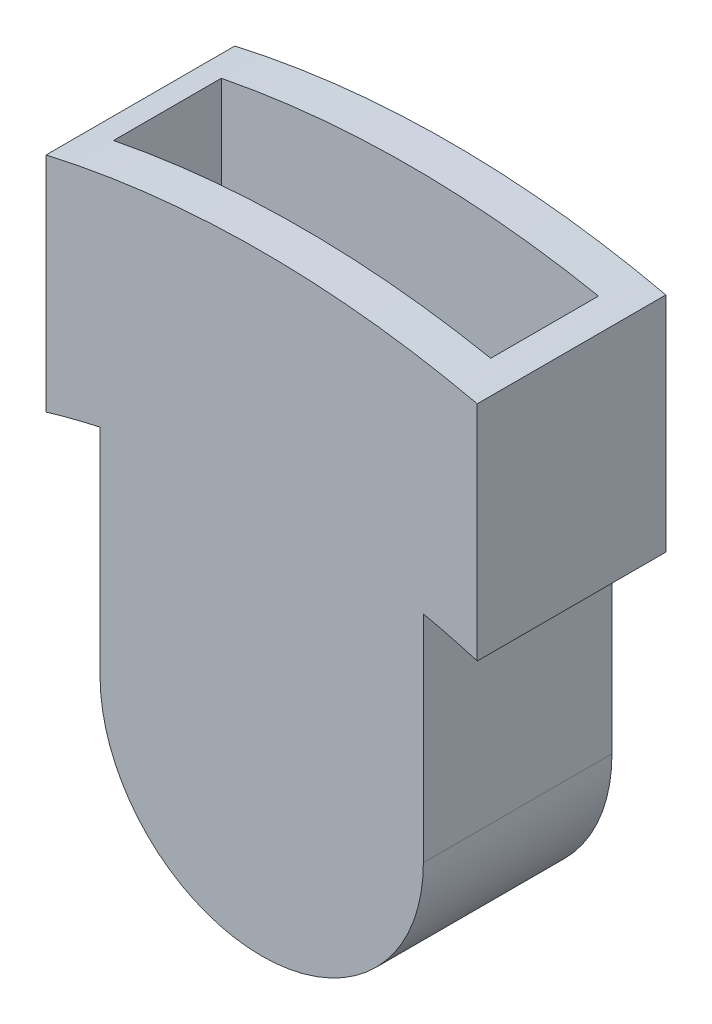
ISO-10303-21;
HEADER;
FILE_DESCRIPTION(('STEP AP214'),'2;1');
FILE_NAME('part.step','',(''),(''),'','','');
FILE_SCHEMA(('AUTOMOTIVE_DESIGN { 1 0 10303 214 1 1 1 1 }'));
ENDSEC;
DATA;
#1=APPLICATION_CONTEXT('core data for automotive mechanical design processes');
#2=APPLICATION_PROTOCOL_DEFINITION('international standard','automotive_design',2000,#1);
#3=PRODUCT_CONTEXT('',#1,'mechanical');
#4=PRODUCT('Part','Part','',(#3));
#5=PRODUCT_RELATED_PRODUCT_CATEGORY('part','',(#4));
#6=PRODUCT_DEFINITION_FORMATION('','',#4);
#7=PRODUCT_DEFINITION_CONTEXT('part definition',#1,'design');
#8=PRODUCT_DEFINITION('design','',#6,#7);
#9=PRODUCT_DEFINITION_SHAPE('','',#8);
#10=(LENGTH_UNIT() NAMED_UNIT(*) SI_UNIT(.MILLI.,.METRE.));
#11=(NAMED_UNIT(*) PLANE_ANGLE_UNIT() SI_UNIT($,.RADIAN.));
#12=(NAMED_UNIT(*) SI_UNIT($,.STERADIAN.) SOLID_ANGLE_UNIT());
#13=UNCERTAINTY_MEASURE_WITH_UNIT(LENGTH_MEASURE(1.E-05),#10,'distance_accuracy_value','');
#14=(GEOMETRIC_REPRESENTATION_CONTEXT(3) GLOBAL_UNCERTAINTY_ASSIGNED_CONTEXT((#13)) GLOBAL_UNIT_ASSIGNED_CONTEXT((#10,
#11,#12)) REPRESENTATION_CONTEXT('',''));
#15=CARTESIAN_POINT('',(0.,0.,0.));
#16=DIRECTION('',(0.,0.,1.));
#17=DIRECTION('',(1.,0.,0.));
#18=AXIS2_PLACEMENT_3D('',#15,#16,#17);
#19=CARTESIAN_POINT('',(3.,9.67479523881774,3.5));
#20=DIRECTION('',(-1.,0.,0.));
#21=DIRECTION('',(0.,-1.,0.));
#22=AXIS2_PLACEMENT_3D('',#19,#20,#21);
#23=PLANE('',#22);
#24=DIRECTION('',(0.,1.,0.));
#25=VECTOR('',#24,1.);
#26=CARTESIAN_POINT('',(3.,9.67479523881774,0.));
#27=LINE('',#26,#25);
#28=CARTESIAN_POINT('',(3.,9.67479523881773,0.));
#29=VERTEX_POINT('',#28);
#30=CARTESIAN_POINT('',(3.,13.6747943311773,0.));
#31=VERTEX_POINT('',#30);
#32=EDGE_CURVE('E138',#29,#31,#27,.T.);
#33=ORIENTED_EDGE('',*,*,#32,.T.);
#34=DIRECTION('',(0.,0.,-1.));
#35=VECTOR('',#34,1.);
#36=CARTESIAN_POINT('',(3.,13.6747943311773,3.5));
#37=LINE('',#36,#35);
#38=CARTESIAN_POINT('',(3.,13.6747943311773,3.5));
#39=VERTEX_POINT('',#38);
#40=EDGE_CURVE('E175',#39,#31,#37,.T.);
#41=ORIENTED_EDGE('',*,*,#40,.F.);
#42=DIRECTION('',(0.,1.,0.));
#43=VECTOR('',#42,1.);
#44=CARTESIAN_POINT('',(3.,9.67479523881774,3.5));
#45=LINE('',#44,#43);
#46=CARTESIAN_POINT('',(3.,9.67479523881773,3.5));
#47=VERTEX_POINT('',#46);
#48=EDGE_CURVE('E84',#47,#39,#45,.T.);
#49=ORIENTED_EDGE('',*,*,#48,.F.);
#50=DIRECTION('',(0.,0.,-1.));
#51=VECTOR('',#50,1.);
#52=CARTESIAN_POINT('',(3.,9.67479523881773,3.5));
#53=LINE('',#52,#51);
#54=EDGE_CURVE('E179',#47,#29,#53,.T.);
#55=ORIENTED_EDGE('',*,*,#54,.T.);
#56=EDGE_LOOP('',(#33,#41,#49,#55));
#57=FACE_BOUND('',#56,.T.);
#58=ADVANCED_FACE('F17',(#57),#23,.F.);
#59=CARTESIAN_POINT('',(0.,0.,3.5));
#60=DIRECTION('',(0.,0.,-1.));
#61=DIRECTION('',(-1.,0.,0.));
#62=AXIS2_PLACEMENT_3D('',#59,#60,#61);
#63=CYLINDRICAL_SURFACE('',#62,14.);
#64=CARTESIAN_POINT('',(0.,0.,0.));
#65=DIRECTION('',(0.,0.,-1.));
#66=DIRECTION('',(1.,0.,0.));
#67=AXIS2_PLACEMENT_3D('',#64,#65,#66);
#68=CIRCLE('',#67,14.);
#69=CARTESIAN_POINT('',(4.00000000004449,13.4164078649855,0.));
#70=VERTEX_POINT('',#69);
#71=EDGE_CURVE('E141',#31,#70,#68,.T.);
#72=ORIENTED_EDGE('',*,*,#71,.T.);
#73=DIRECTION('',(0.,0.,-1.));
#74=VECTOR('',#73,1.);
#75=CARTESIAN_POINT('',(4.00000000004449,13.4164078649855,3.5));
#76=LINE('',#75,#74);
#77=CARTESIAN_POINT('',(4.00000000004449,13.4164078649855,3.5));
#78=VERTEX_POINT('',#77);
#79=EDGE_CURVE('E171',#78,#70,#76,.T.);
#80=ORIENTED_EDGE('',*,*,#79,.F.);
#81=CARTESIAN_POINT('',(0.,0.,3.5));
#82=DIRECTION('',(0.,0.,-1.));
#83=DIRECTION('',(1.,0.,0.));
#84=AXIS2_PLACEMENT_3D('',#81,#82,#83);
#85=CIRCLE('',#84,14.);
#86=EDGE_CURVE('E233',#39,#78,#85,.T.);
#87=ORIENTED_EDGE('',*,*,#86,.F.);
#88=ORIENTED_EDGE('',*,*,#40,.T.);
#89=EDGE_LOOP('',(#72,#80,#87,#88));
#90=FACE_BOUND('',#89,.T.);
#91=ADVANCED_FACE('F279',(#90),#63,.F.);
#92=CARTESIAN_POINT('',(4.,13.4164078649987,3.5));
#93=DIRECTION('',(-1.,0.,0.));
#94=DIRECTION('',(0.,-1.,0.));
#95=AXIS2_PLACEMENT_3D('',#92,#93,#94);
#96=PLANE('',#95);
#97=DIRECTION('',(0.,1.,0.));
#98=VECTOR('',#97,1.);
#99=CARTESIAN_POINT('',(4.,13.4164078649987,0.));
#100=LINE('',#99,#98);
#101=CARTESIAN_POINT('',(4.,17.5499297053557,0.));
#102=VERTEX_POINT('',#101);
#103=EDGE_CURVE('E144',#70,#102,#100,.T.);
#104=ORIENTED_EDGE('',*,*,#103,.T.);
#105=DIRECTION('',(0.,0.,-1.));
#106=VECTOR('',#105,1.);
#107=CARTESIAN_POINT('',(4.,17.5499297053557,3.5));
#108=LINE('',#107,#106);
#109=CARTESIAN_POINT('',(4.,17.5499297053557,3.5));
#110=VERTEX_POINT('',#109);
#111=EDGE_CURVE('E167',#110,#102,#108,.T.);
#112=ORIENTED_EDGE('',*,*,#111,.F.);
#113=DIRECTION('',(0.,1.,0.));
#114=VECTOR('',#113,1.);
#115=CARTESIAN_POINT('',(4.,13.4164078649987,3.5));
#116=LINE('',#115,#114);
#117=EDGE_CURVE('E235',#78,#110,#116,.T.);
#118=ORIENTED_EDGE('',*,*,#117,.F.);
#119=ORIENTED_EDGE('',*,*,#79,.T.);
#120=EDGE_LOOP('',(#104,#112,#118,#119));
#121=FACE_BOUND('',#120,.T.);
#122=ADVANCED_FACE('F283',(#121),#96,.F.);
#123=CARTESIAN_POINT('',(0.,0.,3.5));
#124=DIRECTION('',(0.,0.,-1.));
#125=DIRECTION('',(-1.,0.,0.));
#126=AXIS2_PLACEMENT_3D('',#123,#124,#125);
#127=CYLINDRICAL_SURFACE('',#126,18.0000009073034);
#128=DIRECTION('',(0.,0.,-1.));
#129=VECTOR('',#128,1.);
#130=CARTESIAN_POINT('',(-3.4999999038955,17.6564445270178,3.5));
#131=LINE('',#130,#129);
#132=CARTESIAN_POINT('',(-3.4999999038955,17.6564445270178,2.75));
#133=VERTEX_POINT('',#132);
#134=CARTESIAN_POINT('',(-3.4999999038955,17.6564445270178,0.75));
#135=VERTEX_POINT('',#134);
#136=EDGE_CURVE('E11',#133,#135,#131,.T.);
#137=ORIENTED_EDGE('',*,*,#136,.T.);
#138=CARTESIAN_POINT('',(0.,0.,0.75));
#139=DIRECTION('',(0.,0.,-1.));
#140=DIRECTION('',(-1.,0.,0.));
#141=AXIS2_PLACEMENT_3D('',#138,#139,#140);
#142=CIRCLE('',#141,18.0000009073034);
#143=CARTESIAN_POINT('',(3.5000000961045,17.6564444889166,0.75));
#144=VERTEX_POINT('',#143);
#145=EDGE_CURVE('E182',#135,#144,#142,.T.);
#146=ORIENTED_EDGE('',*,*,#145,.T.);
#147=DIRECTION('',(0.,0.,-1.));
#148=VECTOR('',#147,1.);
#149=CARTESIAN_POINT('',(3.5000000961045,17.6564444889166,3.5));
#150=LINE('',#149,#148);
#151=CARTESIAN_POINT('',(3.5000000961045,17.6564444889166,2.75));
#152=VERTEX_POINT('',#151);
#153=EDGE_CURVE('E186',#144,#152,#150,.F.);
#154=ORIENTED_EDGE('',*,*,#153,.T.);
#155=CARTESIAN_POINT('',(0.,0.,2.75));
#156=DIRECTION('',(0.,0.,1.));
#157=DIRECTION('',(1.,0.,0.));
#158=AXIS2_PLACEMENT_3D('',#155,#156,#157);
#159=CIRCLE('',#158,18.0000009073034);
#160=EDGE_CURVE('E25',#152,#133,#159,.T.);
#161=ORIENTED_EDGE('',*,*,#160,.T.);
#162=EDGE_LOOP('',(#137,#146,#154,#161));
#163=FACE_BOUND('',#162,.T.);
#164=CARTESIAN_POINT('',(0.,0.,0.));
#165=DIRECTION('',(0.,0.,1.));
#166=DIRECTION('',(-1.,0.,0.));
#167=AXIS2_PLACEMENT_3D('',#164,#165,#166);
#168=CIRCLE('',#167,18.0000009073034);
#169=CARTESIAN_POINT('',(-4.,17.5499297053557,0.));
#170=VERTEX_POINT('',#169);
#171=EDGE_CURVE('E148',#102,#170,#168,.T.);
#172=ORIENTED_EDGE('',*,*,#171,.T.);
#173=DIRECTION('',(0.,0.,-1.));
#174=VECTOR('',#173,1.);
#175=CARTESIAN_POINT('',(-4.,17.5499297053557,3.5));
#176=LINE('',#175,#174);
#177=CARTESIAN_POINT('',(-4.,17.5499297053557,3.5));
#178=VERTEX_POINT('',#177);
#179=EDGE_CURVE('E121',#178,#170,#176,.T.);
#180=ORIENTED_EDGE('',*,*,#179,.F.);
#181=CARTESIAN_POINT('',(0.,0.,3.5));
#182=DIRECTION('',(0.,0.,1.));
#183=DIRECTION('',(1.,0.,0.));
#184=AXIS2_PLACEMENT_3D('',#181,#182,#183);
#185=CIRCLE('',#184,18.0000009073034);
#186=EDGE_CURVE('E107',#110,#178,#185,.T.);
#187=ORIENTED_EDGE('',*,*,#186,.F.);
#188=ORIENTED_EDGE('',*,*,#111,.T.);
#189=EDGE_LOOP('',(#172,#180,#187,#188));
#190=FACE_BOUND('',#189,.T.);
#191=ADVANCED_FACE('F194',(#163,#190),#127,.T.);
#192=CARTESIAN_POINT('',(-4.,17.5499297053557,3.5));
#193=DIRECTION('',(1.,0.,0.));
#194=DIRECTION('',(0.,1.,0.));
#195=AXIS2_PLACEMENT_3D('',#192,#193,#194);
#196=PLANE('',#195);
#197=DIRECTION('',(0.,-1.,0.));
#198=VECTOR('',#197,1.);
#199=CARTESIAN_POINT('',(-4.,17.5499297053557,0.));
#200=LINE('',#199,#198);
#201=CARTESIAN_POINT('',(-4.,13.4164078649987,0.));
#202=VERTEX_POINT('',#201);
#203=EDGE_CURVE('E117',#170,#202,#200,.T.);
#204=ORIENTED_EDGE('',*,*,#203,.T.);
#205=DIRECTION('',(0.,0.,-1.));
#206=VECTOR('',#205,1.);
#207=CARTESIAN_POINT('',(-4.,13.4164078649987,3.5));
#208=LINE('',#207,#206);
#209=CARTESIAN_POINT('',(-4.,13.4164078649987,3.5));
#210=VERTEX_POINT('',#209);
#211=EDGE_CURVE('E114',#210,#202,#208,.T.);
#212=ORIENTED_EDGE('',*,*,#211,.F.);
#213=DIRECTION('',(0.,-1.,0.));
#214=VECTOR('',#213,1.);
#215=CARTESIAN_POINT('',(-4.,17.5499297053557,3.5));
#216=LINE('',#215,#214);
#217=EDGE_CURVE('E100',#178,#210,#216,.T.);
#218=ORIENTED_EDGE('',*,*,#217,.F.);
#219=ORIENTED_EDGE('',*,*,#179,.T.);
#220=EDGE_LOOP('',(#204,#212,#218,#219));
#221=FACE_BOUND('',#220,.T.);
#222=ADVANCED_FACE('F115',(#221),#196,.F.);
#223=CARTESIAN_POINT('',(0.,0.,3.5));
#224=DIRECTION('',(0.,0.,-1.));
#225=DIRECTION('',(-1.,0.,0.));
#226=AXIS2_PLACEMENT_3D('',#223,#224,#225);
#227=CYLINDRICAL_SURFACE('',#226,14.);
#228=CARTESIAN_POINT('',(0.,0.,0.));
#229=DIRECTION('',(0.,0.,-1.));
#230=DIRECTION('',(-1.,0.,0.));
#231=AXIS2_PLACEMENT_3D('',#228,#229,#230);
#232=CIRCLE('',#231,14.);
#233=CARTESIAN_POINT('',(-3.,13.6747943311773,0.));
#234=VERTEX_POINT('',#233);
#235=EDGE_CURVE('E153',#202,#234,#232,.T.);
#236=ORIENTED_EDGE('',*,*,#235,.T.);
#237=DIRECTION('',(0.,0.,-1.));
#238=VECTOR('',#237,1.);
#239=CARTESIAN_POINT('',(-3.,13.6747943311773,3.5));
#240=LINE('',#239,#238);
#241=CARTESIAN_POINT('',(-3.,13.6747943311773,3.5));
#242=VERTEX_POINT('',#241);
#243=EDGE_CURVE('E122',#242,#234,#240,.T.);
#244=ORIENTED_EDGE('',*,*,#243,.F.);
#245=CARTESIAN_POINT('',(0.,0.,3.5));
#246=DIRECTION('',(0.,0.,-1.));
#247=DIRECTION('',(-1.,0.,0.));
#248=AXIS2_PLACEMENT_3D('',#245,#246,#247);
#249=CIRCLE('',#248,14.);
#250=EDGE_CURVE('E104',#210,#242,#249,.T.);
#251=ORIENTED_EDGE('',*,*,#250,.F.);
#252=ORIENTED_EDGE('',*,*,#211,.T.);
#253=EDGE_LOOP('',(#236,#244,#251,#252));
#254=FACE_BOUND('',#253,.T.);
#255=ADVANCED_FACE('F124',(#254),#227,.F.);
#256=CARTESIAN_POINT('',(-3.,13.6747943311773,3.5));
#257=DIRECTION('',(1.,0.,0.));
#258=DIRECTION('',(0.,1.,0.));
#259=AXIS2_PLACEMENT_3D('',#256,#257,#258);
#260=PLANE('',#259);
#261=DIRECTION('',(0.,-1.,0.));
#262=VECTOR('',#261,1.);
#263=CARTESIAN_POINT('',(-3.,13.6747943311773,0.));
#264=LINE('',#263,#262);
#265=CARTESIAN_POINT('',(-3.,9.67479523881774,0.));
#266=VERTEX_POINT('',#265);
#267=EDGE_CURVE('E76',#234,#266,#264,.T.);
#268=ORIENTED_EDGE('',*,*,#267,.T.);
#269=DIRECTION('',(0.,0.,-1.));
#270=VECTOR('',#269,1.);
#271=CARTESIAN_POINT('',(-3.,9.67479523881774,3.5));
#272=LINE('',#271,#270);
#273=CARTESIAN_POINT('',(-3.,9.67479523881774,3.5));
#274=VERTEX_POINT('',#273);
#275=EDGE_CURVE('E134',#274,#266,#272,.T.);
#276=ORIENTED_EDGE('',*,*,#275,.F.);
#277=DIRECTION('',(0.,-1.,0.));
#278=VECTOR('',#277,1.);
#279=CARTESIAN_POINT('',(-3.,13.6747943311773,3.5));
#280=LINE('',#279,#278);
#281=EDGE_CURVE('E127',#242,#274,#280,.T.);
#282=ORIENTED_EDGE('',*,*,#281,.F.);
#283=ORIENTED_EDGE('',*,*,#243,.T.);
#284=EDGE_LOOP('',(#268,#276,#282,#283));
#285=FACE_BOUND('',#284,.T.);
#286=ADVANCED_FACE('F270',(#285),#260,.F.);
#287=CARTESIAN_POINT('',(0.,9.67479523881773,3.5));
#288=DIRECTION('',(0.,0.,-1.));
#289=DIRECTION('',(-1.,0.,0.));
#290=AXIS2_PLACEMENT_3D('',#287,#288,#289);
#291=CYLINDRICAL_SURFACE('',#290,3.);
#292=CARTESIAN_POINT('',(0.,9.67479523881773,0.));
#293=DIRECTION('',(0.,0.,1.));
#294=DIRECTION('',(-1.,0.,0.));
#295=AXIS2_PLACEMENT_3D('',#292,#293,#294);
#296=CIRCLE('',#295,3.);
#297=EDGE_CURVE('E158',#266,#29,#296,.T.);
#298=ORIENTED_EDGE('',*,*,#297,.T.);
#299=ORIENTED_EDGE('',*,*,#54,.F.);
#300=CARTESIAN_POINT('',(0.,9.67479523881773,3.5));
#301=DIRECTION('',(0.,0.,1.));
#302=DIRECTION('',(1.,0.,0.));
#303=AXIS2_PLACEMENT_3D('',#300,#301,#302);
#304=CIRCLE('',#303,3.);
#305=EDGE_CURVE('E41',#274,#47,#304,.T.);
#306=ORIENTED_EDGE('',*,*,#305,.F.);
#307=ORIENTED_EDGE('',*,*,#275,.T.);
#308=EDGE_LOOP('',(#298,#299,#306,#307));
#309=FACE_BOUND('',#308,.T.);
#310=ADVANCED_FACE('F262',(#309),#291,.T.);
#311=CARTESIAN_POINT('',(0.,9.67479523881773,3.5));
#312=DIRECTION('',(0.,0.,1.));
#313=DIRECTION('',(1.,0.,0.));
#314=AXIS2_PLACEMENT_3D('',#311,#312,#313);
#315=PLANE('',#314);
#316=ORIENTED_EDGE('',*,*,#305,.T.);
#317=ORIENTED_EDGE('',*,*,#48,.T.);
#318=ORIENTED_EDGE('',*,*,#86,.T.);
#319=ORIENTED_EDGE('',*,*,#117,.T.);
#320=ORIENTED_EDGE('',*,*,#186,.T.);
#321=ORIENTED_EDGE('',*,*,#217,.T.);
#322=ORIENTED_EDGE('',*,*,#250,.T.);
#323=ORIENTED_EDGE('',*,*,#281,.T.);
#324=EDGE_LOOP('',(#316,#317,#318,#319,#320,#321,#322,#323));
#325=FACE_BOUND('',#324,.T.);
#326=ADVANCED_FACE('F102',(#325),#315,.T.);
#327=CARTESIAN_POINT('',(0.,9.67479523881773,0.));
#328=DIRECTION('',(0.,0.,1.));
#329=DIRECTION('',(1.,0.,0.));
#330=AXIS2_PLACEMENT_3D('',#327,#328,#329);
#331=PLANE('',#330);
#332=ORIENTED_EDGE('',*,*,#32,.F.);
#333=ORIENTED_EDGE('',*,*,#297,.F.);
#334=ORIENTED_EDGE('',*,*,#267,.F.);
#335=ORIENTED_EDGE('',*,*,#235,.F.);
#336=ORIENTED_EDGE('',*,*,#203,.F.);
#337=ORIENTED_EDGE('',*,*,#171,.F.);
#338=ORIENTED_EDGE('',*,*,#103,.F.);
#339=ORIENTED_EDGE('',*,*,#71,.F.);
#340=EDGE_LOOP('',(#332,#333,#334,#335,#336,#337,#338,#339));
#341=FACE_BOUND('',#340,.T.);
#342=ADVANCED_FACE('F246',(#341),#331,.F.);
#343=CARTESIAN_POINT('',(-3.4999999038955,14.,0.75));
#344=DIRECTION('',(-1.,0.,0.));
#345=DIRECTION('',(0.,0.,1.));
#346=AXIS2_PLACEMENT_3D('',#343,#344,#345);
#347=PLANE('',#346);
#348=DIRECTION('',(0.,1.,0.));
#349=VECTOR('',#348,1.);
#350=CARTESIAN_POINT('',(-3.4999999038955,14.,2.75));
#351=LINE('',#350,#349);
#352=CARTESIAN_POINT('',(-3.4999999038955,14.,2.75));
#353=VERTEX_POINT('',#352);
#354=EDGE_CURVE('E142',#133,#353,#351,.F.);
#355=ORIENTED_EDGE('',*,*,#354,.T.);
#356=DIRECTION('',(0.,0.,1.));
#357=VECTOR('',#356,1.);
#358=CARTESIAN_POINT('',(-3.4999999038955,14.,0.75));
#359=LINE('',#358,#357);
#360=CARTESIAN_POINT('',(-3.4999999038955,14.,0.75));
#361=VERTEX_POINT('',#360);
#362=EDGE_CURVE('E451',#353,#361,#359,.F.);
#363=ORIENTED_EDGE('',*,*,#362,.T.);
#364=DIRECTION('',(0.,1.,0.));
#365=VECTOR('',#364,1.);
#366=CARTESIAN_POINT('',(-3.4999999038955,14.,0.75));
#367=LINE('',#366,#365);
#368=EDGE_CURVE('E221',#135,#361,#367,.F.);
#369=ORIENTED_EDGE('',*,*,#368,.F.);
#370=ORIENTED_EDGE('',*,*,#136,.F.);
#371=EDGE_LOOP('',(#355,#363,#369,#370));
#372=FACE_BOUND('',#371,.T.);
#373=ADVANCED_FACE('F251',(#372),#347,.F.);
#374=CARTESIAN_POINT('',(-3.4999999038955,14.,2.75));
#375=DIRECTION('',(0.,0.,1.));
#376=DIRECTION('',(1.,0.,0.));
#377=AXIS2_PLACEMENT_3D('',#374,#375,#376);
#378=PLANE('',#377);
#379=DIRECTION('',(0.,1.,0.));
#380=VECTOR('',#379,1.);
#381=CARTESIAN_POINT('',(3.5000000961045,14.,2.75));
#382=LINE('',#381,#380);
#383=CARTESIAN_POINT('',(3.5000000961045,14.,2.75));
#384=VERTEX_POINT('',#383);
#385=EDGE_CURVE('E206',#152,#384,#382,.F.);
#386=ORIENTED_EDGE('',*,*,#385,.T.);
#387=DIRECTION('',(1.,0.,0.));
#388=VECTOR('',#387,1.);
#389=CARTESIAN_POINT('',(-3.4999999038955,14.,2.75));
#390=LINE('',#389,#388);
#391=EDGE_CURVE('E452',#384,#353,#390,.F.);
#392=ORIENTED_EDGE('',*,*,#391,.T.);
#393=ORIENTED_EDGE('',*,*,#354,.F.);
#394=ORIENTED_EDGE('',*,*,#160,.F.);
#395=EDGE_LOOP('',(#386,#392,#393,#394));
#396=FACE_BOUND('',#395,.T.);
#397=ADVANCED_FACE('F203',(#396),#378,.F.);
#398=CARTESIAN_POINT('',(3.5000000961045,14.,2.75));
#399=DIRECTION('',(1.,0.,0.));
#400=DIRECTION('',(0.,0.,-1.));
#401=AXIS2_PLACEMENT_3D('',#398,#399,#400);
#402=PLANE('',#401);
#403=DIRECTION('',(0.,1.,0.));
#404=VECTOR('',#403,1.);
#405=CARTESIAN_POINT('',(3.5000000961045,14.,0.75));
#406=LINE('',#405,#404);
#407=CARTESIAN_POINT('',(3.5000000961045,14.,0.75));
#408=VERTEX_POINT('',#407);
#409=EDGE_CURVE('E32',#144,#408,#406,.F.);
#410=ORIENTED_EDGE('',*,*,#409,.T.);
#411=DIRECTION('',(0.,0.,-1.));
#412=VECTOR('',#411,1.);
#413=CARTESIAN_POINT('',(3.5000000961045,14.,2.75));
#414=LINE('',#413,#412);
#415=EDGE_CURVE('E213',#408,#384,#414,.F.);
#416=ORIENTED_EDGE('',*,*,#415,.T.);
#417=ORIENTED_EDGE('',*,*,#385,.F.);
#418=ORIENTED_EDGE('',*,*,#153,.F.);
#419=EDGE_LOOP('',(#410,#416,#417,#418));
#420=FACE_BOUND('',#419,.T.);
#421=ADVANCED_FACE('F211',(#420),#402,.F.);
#422=CARTESIAN_POINT('',(3.5000000961045,14.,0.75));
#423=DIRECTION('',(0.,0.,-1.));
#424=DIRECTION('',(-1.,0.,0.));
#425=AXIS2_PLACEMENT_3D('',#422,#423,#424);
#426=PLANE('',#425);
#427=ORIENTED_EDGE('',*,*,#368,.T.);
#428=DIRECTION('',(-1.,0.,0.));
#429=VECTOR('',#428,1.);
#430=CARTESIAN_POINT('',(3.5000000961045,14.,0.75));
#431=LINE('',#430,#429);
#432=EDGE_CURVE('E228',#361,#408,#431,.F.);
#433=ORIENTED_EDGE('',*,*,#432,.T.);
#434=ORIENTED_EDGE('',*,*,#409,.F.);
#435=ORIENTED_EDGE('',*,*,#145,.F.);
#436=EDGE_LOOP('',(#427,#433,#434,#435));
#437=FACE_BOUND('',#436,.T.);
#438=ADVANCED_FACE('F391',(#437),#426,.F.);
#439=CARTESIAN_POINT('',(0.,14.,0.));
#440=DIRECTION('',(0.,1.,0.));
#441=DIRECTION('',(0.,0.,1.));
#442=AXIS2_PLACEMENT_3D('',#439,#440,#441);
#443=PLANE('',#442);
#444=ORIENTED_EDGE('',*,*,#362,.F.);
#445=ORIENTED_EDGE('',*,*,#391,.F.);
#446=ORIENTED_EDGE('',*,*,#415,.F.);
#447=ORIENTED_EDGE('',*,*,#432,.F.);
#448=EDGE_LOOP('',(#444,#445,#446,#447));
#449=FACE_BOUND('',#448,.T.);
#450=ADVANCED_FACE('F398',(#449),#443,.T.);
#451=CLOSED_SHELL('',(#58,#91,#122,#191,#222,#255,#286,#310,#326,#342,#373,#397,#421,#438,#450));
#452=MANIFOLD_SOLID_BREP('B1',#451);
#453=ADVANCED_BREP_SHAPE_REPRESENTATION('',(#18,#452),#14);
#454=SHAPE_DEFINITION_REPRESENTATION(#9,#453);
ENDSEC;
END-ISO-10303-21;
